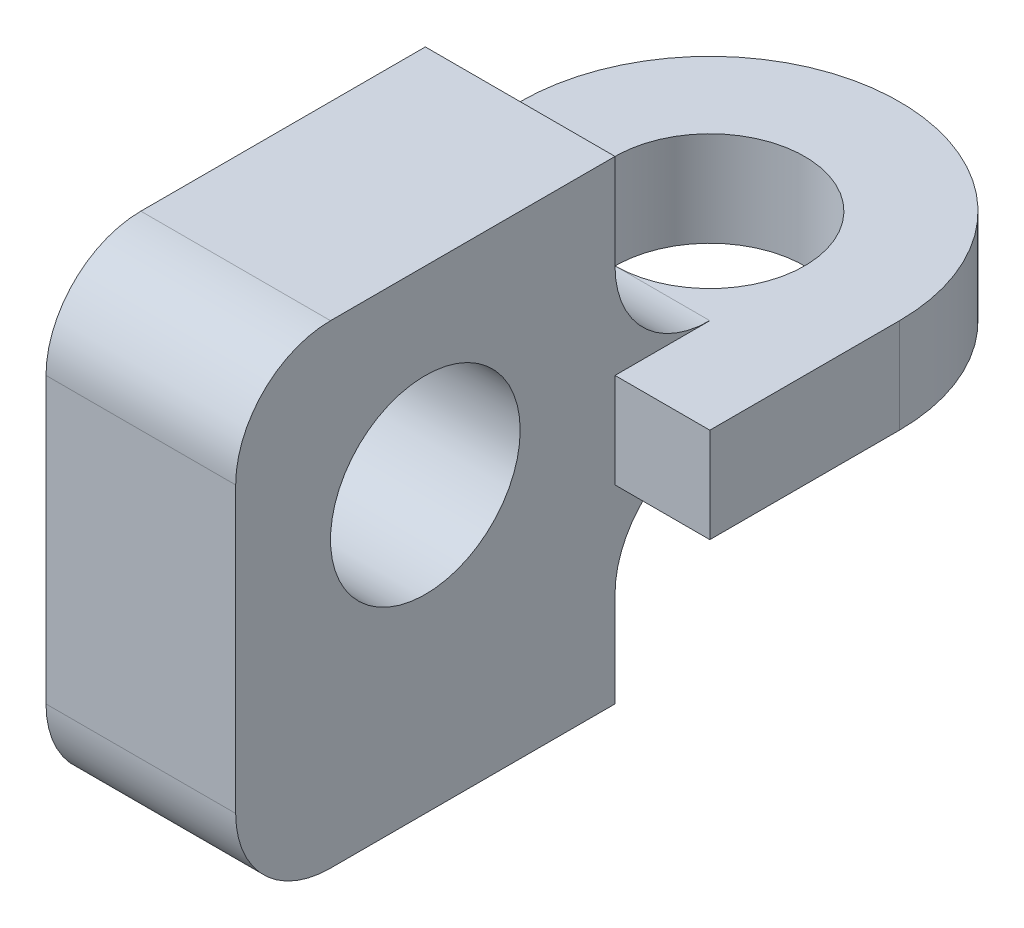
ISO-10303-21;
HEADER;
FILE_DESCRIPTION(('STEP AP214'),'2;1');
FILE_NAME('part.step','',(''),(''),'','','');
FILE_SCHEMA(('AUTOMOTIVE_DESIGN { 1 0 10303 214 1 1 1 1 }'));
ENDSEC;
DATA;
#1=APPLICATION_CONTEXT('core data for automotive mechanical design processes');
#2=APPLICATION_PROTOCOL_DEFINITION('international standard','automotive_design',2000,#1);
#3=PRODUCT_CONTEXT('',#1,'mechanical');
#4=PRODUCT('Part','Part','',(#3));
#5=PRODUCT_RELATED_PRODUCT_CATEGORY('part','',(#4));
#6=PRODUCT_DEFINITION_FORMATION('','',#4);
#7=PRODUCT_DEFINITION_CONTEXT('part definition',#1,'design');
#8=PRODUCT_DEFINITION('design','',#6,#7);
#9=PRODUCT_DEFINITION_SHAPE('','',#8);
#10=(LENGTH_UNIT() NAMED_UNIT(*) SI_UNIT(.MILLI.,.METRE.));
#11=(NAMED_UNIT(*) PLANE_ANGLE_UNIT() SI_UNIT($,.RADIAN.));
#12=(NAMED_UNIT(*) SI_UNIT($,.STERADIAN.) SOLID_ANGLE_UNIT());
#13=UNCERTAINTY_MEASURE_WITH_UNIT(LENGTH_MEASURE(1.E-05),#10,'distance_accuracy_value','');
#14=(GEOMETRIC_REPRESENTATION_CONTEXT(3) GLOBAL_UNCERTAINTY_ASSIGNED_CONTEXT((#13)) GLOBAL_UNIT_ASSIGNED_CONTEXT((#10,
#11,#12)) REPRESENTATION_CONTEXT('',''));
#15=CARTESIAN_POINT('',(0.,0.,0.));
#16=DIRECTION('',(0.,0.,1.));
#17=DIRECTION('',(1.,0.,0.));
#18=AXIS2_PLACEMENT_3D('',#15,#16,#17);
#19=CARTESIAN_POINT('',(254.,609.6,-508.));
#20=DIRECTION('',(-1.,0.,0.));
#21=DIRECTION('',(0.,0.,1.));
#22=AXIS2_PLACEMENT_3D('',#19,#20,#21);
#23=CYLINDRICAL_SURFACE('',#22,254.);
#24=CARTESIAN_POINT('',(-254.,609.6,-508.));
#25=DIRECTION('',(1.,0.,0.));
#26=DIRECTION('',(0.,0.,-1.));
#27=AXIS2_PLACEMENT_3D('',#24,#25,#26);
#28=CIRCLE('',#27,254.);
#29=CARTESIAN_POINT('',(-254.,355.6,-508.000000000002));
#30=VERTEX_POINT('',#29);
#31=CARTESIAN_POINT('',(-254.,609.600000000002,-254.));
#32=VERTEX_POINT('',#31);
#33=EDGE_CURVE('E224',#30,#32,#28,.F.);
#34=ORIENTED_EDGE('',*,*,#33,.T.);
#35=DIRECTION('',(-1.,0.,0.));
#36=VECTOR('',#35,1.);
#37=CARTESIAN_POINT('',(254.,609.600000000002,-254.));
#38=LINE('',#37,#36);
#39=CARTESIAN_POINT('',(254.,609.600000000002,-254.));
#40=VERTEX_POINT('',#39);
#41=EDGE_CURVE('E40',#40,#32,#38,.T.);
#42=ORIENTED_EDGE('',*,*,#41,.F.);
#43=CARTESIAN_POINT('',(254.,609.6,-508.));
#44=DIRECTION('',(1.,0.,0.));
#45=DIRECTION('',(0.,0.,-1.));
#46=AXIS2_PLACEMENT_3D('',#43,#44,#45);
#47=CIRCLE('',#46,254.);
#48=CARTESIAN_POINT('',(254.,355.6,-508.000000000002));
#49=VERTEX_POINT('',#48);
#50=EDGE_CURVE('E196',#49,#40,#47,.F.);
#51=ORIENTED_EDGE('',*,*,#50,.F.);
#52=DIRECTION('',(-1.,0.,0.));
#53=VECTOR('',#52,1.);
#54=CARTESIAN_POINT('',(254.,355.6,-508.000000000002));
#55=LINE('',#54,#53);
#56=CARTESIAN_POINT('',(0.,355.6,-508.000000000002));
#57=VERTEX_POINT('',#56);
#58=EDGE_CURVE('E11',#49,#57,#55,.T.);
#59=ORIENTED_EDGE('',*,*,#58,.T.);
#60=DIRECTION('',(-1.,0.,0.));
#61=VECTOR('',#60,1.);
#62=CARTESIAN_POINT('',(254.,355.6,-508.));
#63=LINE('',#62,#61);
#64=EDGE_CURVE('E180',#30,#57,#63,.F.);
#65=ORIENTED_EDGE('',*,*,#64,.F.);
#66=EDGE_LOOP('',(#34,#42,#51,#59,#65));
#67=FACE_BOUND('',#66,.T.);
#68=ADVANCED_FACE('F33',(#67),#23,.F.);
#69=CARTESIAN_POINT('',(254.,0.,-254.));
#70=DIRECTION('',(0.,0.,1.));
#71=DIRECTION('',(0.,-1.,0.));
#72=AXIS2_PLACEMENT_3D('',#69,#70,#71);
#73=PLANE('',#72);
#74=DIRECTION('',(0.,1.,0.));
#75=VECTOR('',#74,1.);
#76=CARTESIAN_POINT('',(-254.,0.,-254.));
#77=LINE('',#76,#75);
#78=CARTESIAN_POINT('',(-254.,863.6,-254.));
#79=VERTEX_POINT('',#78);
#80=EDGE_CURVE('E226',#32,#79,#77,.T.);
#81=ORIENTED_EDGE('',*,*,#80,.T.);
#82=DIRECTION('',(-1.,0.,0.));
#83=VECTOR('',#82,1.);
#84=CARTESIAN_POINT('',(254.,863.6,-254.));
#85=LINE('',#84,#83);
#86=CARTESIAN_POINT('',(254.,863.6,-254.));
#87=VERTEX_POINT('',#86);
#88=EDGE_CURVE('E263',#87,#79,#85,.T.);
#89=ORIENTED_EDGE('',*,*,#88,.F.);
#90=DIRECTION('',(0.,1.,0.));
#91=VECTOR('',#90,1.);
#92=CARTESIAN_POINT('',(254.,0.,-254.));
#93=LINE('',#92,#91);
#94=EDGE_CURVE('E198',#40,#87,#93,.T.);
#95=ORIENTED_EDGE('',*,*,#94,.F.);
#96=ORIENTED_EDGE('',*,*,#41,.T.);
#97=EDGE_LOOP('',(#81,#89,#95,#96));
#98=FACE_BOUND('',#97,.T.);
#99=ADVANCED_FACE('F270',(#98),#73,.F.);
#100=CARTESIAN_POINT('',(254.,863.6,1.25825276124185E-13));
#101=DIRECTION('',(0.,-1.,0.));
#102=DIRECTION('',(0.,0.,-1.));
#103=AXIS2_PLACEMENT_3D('',#100,#101,#102);
#104=PLANE('',#103);
#105=DIRECTION('',(0.,0.,1.));
#106=VECTOR('',#105,1.);
#107=CARTESIAN_POINT('',(-254.,863.6,1.25825276124185E-13));
#108=LINE('',#107,#106);
#109=CARTESIAN_POINT('',(-254.,863.6,507.999999999999));
#110=VERTEX_POINT('',#109);
#111=EDGE_CURVE('E228',#79,#110,#108,.T.);
#112=ORIENTED_EDGE('',*,*,#111,.T.);
#113=DIRECTION('',(-1.,0.,0.));
#114=VECTOR('',#113,1.);
#115=CARTESIAN_POINT('',(254.,863.6,507.999999999999));
#116=LINE('',#115,#114);
#117=CARTESIAN_POINT('',(254.,863.6,507.999999999999));
#118=VERTEX_POINT('',#117);
#119=EDGE_CURVE('E261',#118,#110,#116,.T.);
#120=ORIENTED_EDGE('',*,*,#119,.F.);
#121=DIRECTION('',(0.,0.,1.));
#122=VECTOR('',#121,1.);
#123=CARTESIAN_POINT('',(254.,863.6,1.25825276124185E-13));
#124=LINE('',#123,#122);
#125=EDGE_CURVE('E200',#87,#118,#124,.T.);
#126=ORIENTED_EDGE('',*,*,#125,.F.);
#127=ORIENTED_EDGE('',*,*,#88,.T.);
#128=EDGE_LOOP('',(#112,#120,#126,#127));
#129=FACE_BOUND('',#128,.T.);
#130=ADVANCED_FACE('F282',(#129),#104,.F.);
#131=CARTESIAN_POINT('',(254.,609.6,508.));
#132=DIRECTION('',(-1.,0.,0.));
#133=DIRECTION('',(0.,0.,1.));
#134=AXIS2_PLACEMENT_3D('',#131,#132,#133);
#135=CYLINDRICAL_SURFACE('',#134,254.);
#136=CARTESIAN_POINT('',(-254.,609.6,508.));
#137=DIRECTION('',(1.,0.,0.));
#138=DIRECTION('',(0.,0.,-1.));
#139=AXIS2_PLACEMENT_3D('',#136,#137,#138);
#140=CIRCLE('',#139,254.);
#141=CARTESIAN_POINT('',(-254.,609.599999999998,762.));
#142=VERTEX_POINT('',#141);
#143=EDGE_CURVE('E231',#142,#110,#140,.F.);
#144=ORIENTED_EDGE('',*,*,#143,.F.);
#145=DIRECTION('',(-1.,0.,0.));
#146=VECTOR('',#145,1.);
#147=CARTESIAN_POINT('',(254.,609.599999999998,762.));
#148=LINE('',#147,#146);
#149=CARTESIAN_POINT('',(254.,609.599999999998,762.));
#150=VERTEX_POINT('',#149);
#151=EDGE_CURVE('E259',#150,#142,#148,.T.);
#152=ORIENTED_EDGE('',*,*,#151,.F.);
#153=CARTESIAN_POINT('',(254.,609.6,508.));
#154=DIRECTION('',(1.,0.,0.));
#155=DIRECTION('',(0.,0.,-1.));
#156=AXIS2_PLACEMENT_3D('',#153,#154,#155);
#157=CIRCLE('',#156,254.);
#158=EDGE_CURVE('E202',#150,#118,#157,.F.);
#159=ORIENTED_EDGE('',*,*,#158,.T.);
#160=ORIENTED_EDGE('',*,*,#119,.T.);
#161=EDGE_LOOP('',(#144,#152,#159,#160));
#162=FACE_BOUND('',#161,.T.);
#163=ADVANCED_FACE('F344',(#162),#135,.T.);
#164=CARTESIAN_POINT('',(254.,-2.22044604925032E-13,762.));
#165=DIRECTION('',(0.,0.,-1.));
#166=DIRECTION('',(0.,1.,0.));
#167=AXIS2_PLACEMENT_3D('',#164,#165,#166);
#168=PLANE('',#167);
#169=DIRECTION('',(0.,-1.,0.));
#170=VECTOR('',#169,1.);
#171=CARTESIAN_POINT('',(-254.,-2.22044604925032E-13,762.));
#172=LINE('',#171,#170);
#173=CARTESIAN_POINT('',(-254.,-152.399999999998,762.));
#174=VERTEX_POINT('',#173);
#175=EDGE_CURVE('E234',#142,#174,#172,.T.);
#176=ORIENTED_EDGE('',*,*,#175,.T.);
#177=DIRECTION('',(-1.,0.,0.));
#178=VECTOR('',#177,1.);
#179=CARTESIAN_POINT('',(254.,-152.399999999998,762.));
#180=LINE('',#179,#178);
#181=CARTESIAN_POINT('',(254.,-152.399999999998,762.));
#182=VERTEX_POINT('',#181);
#183=EDGE_CURVE('E256',#182,#174,#180,.T.);
#184=ORIENTED_EDGE('',*,*,#183,.F.);
#185=DIRECTION('',(0.,-1.,0.));
#186=VECTOR('',#185,1.);
#187=CARTESIAN_POINT('',(254.,-2.22044604925032E-13,762.));
#188=LINE('',#187,#186);
#189=EDGE_CURVE('E205',#150,#182,#188,.T.);
#190=ORIENTED_EDGE('',*,*,#189,.F.);
#191=ORIENTED_EDGE('',*,*,#151,.T.);
#192=EDGE_LOOP('',(#176,#184,#190,#191));
#193=FACE_BOUND('',#192,.T.);
#194=ADVANCED_FACE('F342',(#193),#168,.F.);
#195=CARTESIAN_POINT('',(254.,-152.4,508.));
#196=DIRECTION('',(-1.,0.,0.));
#197=DIRECTION('',(0.,0.,1.));
#198=AXIS2_PLACEMENT_3D('',#195,#196,#197);
#199=CYLINDRICAL_SURFACE('',#198,254.);
#200=CARTESIAN_POINT('',(-254.,-152.4,508.));
#201=DIRECTION('',(1.,0.,0.));
#202=DIRECTION('',(0.,0.,-1.));
#203=AXIS2_PLACEMENT_3D('',#200,#201,#202);
#204=CIRCLE('',#203,254.);
#205=CARTESIAN_POINT('',(-254.,-406.4,507.999999999998));
#206=VERTEX_POINT('',#205);
#207=EDGE_CURVE('E236',#174,#206,#204,.T.);
#208=ORIENTED_EDGE('',*,*,#207,.T.);
#209=DIRECTION('',(-1.,0.,0.));
#210=VECTOR('',#209,1.);
#211=CARTESIAN_POINT('',(254.,-406.4,507.999999999998));
#212=LINE('',#211,#210);
#213=CARTESIAN_POINT('',(254.,-406.4,507.999999999998));
#214=VERTEX_POINT('',#213);
#215=EDGE_CURVE('E253',#214,#206,#212,.T.);
#216=ORIENTED_EDGE('',*,*,#215,.F.);
#217=CARTESIAN_POINT('',(254.,-152.4,508.));
#218=DIRECTION('',(1.,0.,0.));
#219=DIRECTION('',(0.,0.,-1.));
#220=AXIS2_PLACEMENT_3D('',#217,#218,#219);
#221=CIRCLE('',#220,254.);
#222=EDGE_CURVE('E207',#182,#214,#221,.T.);
#223=ORIENTED_EDGE('',*,*,#222,.F.);
#224=ORIENTED_EDGE('',*,*,#183,.T.);
#225=EDGE_LOOP('',(#208,#216,#223,#224));
#226=FACE_BOUND('',#225,.T.);
#227=ADVANCED_FACE('F337',(#226),#199,.T.);
#228=CARTESIAN_POINT('',(254.,-406.4,0.));
#229=DIRECTION('',(0.,1.,0.));
#230=DIRECTION('',(0.,0.,1.));
#231=AXIS2_PLACEMENT_3D('',#228,#229,#230);
#232=PLANE('',#231);
#233=DIRECTION('',(0.,0.,-1.));
#234=VECTOR('',#233,1.);
#235=CARTESIAN_POINT('',(-254.,-406.4,0.));
#236=LINE('',#235,#234);
#237=CARTESIAN_POINT('',(-254.,-406.4,-254.));
#238=VERTEX_POINT('',#237);
#239=EDGE_CURVE('E238',#206,#238,#236,.T.);
#240=ORIENTED_EDGE('',*,*,#239,.T.);
#241=DIRECTION('',(-1.,0.,0.));
#242=VECTOR('',#241,1.);
#243=CARTESIAN_POINT('',(254.,-406.4,-254.));
#244=LINE('',#243,#242);
#245=CARTESIAN_POINT('',(254.,-406.4,-254.));
#246=VERTEX_POINT('',#245);
#247=EDGE_CURVE('E250',#246,#238,#244,.T.);
#248=ORIENTED_EDGE('',*,*,#247,.F.);
#249=DIRECTION('',(0.,0.,-1.));
#250=VECTOR('',#249,1.);
#251=CARTESIAN_POINT('',(254.,-406.4,0.));
#252=LINE('',#251,#250);
#253=EDGE_CURVE('E209',#214,#246,#252,.T.);
#254=ORIENTED_EDGE('',*,*,#253,.F.);
#255=ORIENTED_EDGE('',*,*,#215,.T.);
#256=EDGE_LOOP('',(#240,#248,#254,#255));
#257=FACE_BOUND('',#256,.T.);
#258=ADVANCED_FACE('F333',(#257),#232,.F.);
#259=CARTESIAN_POINT('',(254.,0.,-254.));
#260=DIRECTION('',(0.,0.,1.));
#261=DIRECTION('',(0.,-1.,0.));
#262=AXIS2_PLACEMENT_3D('',#259,#260,#261);
#263=PLANE('',#262);
#264=DIRECTION('',(0.,1.,0.));
#265=VECTOR('',#264,1.);
#266=CARTESIAN_POINT('',(-254.,0.,-254.));
#267=LINE('',#266,#265);
#268=CARTESIAN_POINT('',(-254.,-152.400000000002,-254.));
#269=VERTEX_POINT('',#268);
#270=EDGE_CURVE('E240',#238,#269,#267,.T.);
#271=ORIENTED_EDGE('',*,*,#270,.T.);
#272=DIRECTION('',(-1.,0.,0.));
#273=VECTOR('',#272,1.);
#274=CARTESIAN_POINT('',(254.,-152.400000000002,-254.));
#275=LINE('',#274,#273);
#276=CARTESIAN_POINT('',(254.,-152.400000000002,-254.));
#277=VERTEX_POINT('',#276);
#278=EDGE_CURVE('E247',#277,#269,#275,.T.);
#279=ORIENTED_EDGE('',*,*,#278,.F.);
#280=DIRECTION('',(0.,1.,0.));
#281=VECTOR('',#280,1.);
#282=CARTESIAN_POINT('',(254.,0.,-254.));
#283=LINE('',#282,#281);
#284=EDGE_CURVE('E211',#246,#277,#283,.T.);
#285=ORIENTED_EDGE('',*,*,#284,.F.);
#286=ORIENTED_EDGE('',*,*,#247,.T.);
#287=EDGE_LOOP('',(#271,#279,#285,#286));
#288=FACE_BOUND('',#287,.T.);
#289=ADVANCED_FACE('F329',(#288),#263,.F.);
#290=CARTESIAN_POINT('',(254.,-152.4,-508.));
#291=DIRECTION('',(-1.,0.,0.));
#292=DIRECTION('',(0.,0.,1.));
#293=AXIS2_PLACEMENT_3D('',#290,#291,#292);
#294=CYLINDRICAL_SURFACE('',#293,254.);
#295=CARTESIAN_POINT('',(-254.,-152.4,-508.));
#296=DIRECTION('',(1.,0.,0.));
#297=DIRECTION('',(0.,0.,-1.));
#298=AXIS2_PLACEMENT_3D('',#295,#296,#297);
#299=CIRCLE('',#298,254.);
#300=CARTESIAN_POINT('',(-254.,101.6,-508.000000000002));
#301=VERTEX_POINT('',#300);
#302=EDGE_CURVE('E242',#269,#301,#299,.F.);
#303=ORIENTED_EDGE('',*,*,#302,.T.);
#304=DIRECTION('',(-1.,0.,0.));
#305=VECTOR('',#304,1.);
#306=CARTESIAN_POINT('',(254.,101.6,-508.));
#307=LINE('',#306,#305);
#308=CARTESIAN_POINT('',(0.,101.6,-508.000000000002));
#309=VERTEX_POINT('',#308);
#310=EDGE_CURVE('E53',#301,#309,#307,.F.);
#311=ORIENTED_EDGE('',*,*,#310,.T.);
#312=DIRECTION('',(-1.,0.,0.));
#313=VECTOR('',#312,1.);
#314=CARTESIAN_POINT('',(254.,101.6,-508.000000000002));
#315=LINE('',#314,#313);
#316=CARTESIAN_POINT('',(254.,101.6,-508.000000000002));
#317=VERTEX_POINT('',#316);
#318=EDGE_CURVE('E218',#317,#309,#315,.T.);
#319=ORIENTED_EDGE('',*,*,#318,.F.);
#320=CARTESIAN_POINT('',(254.,-152.4,-508.));
#321=DIRECTION('',(1.,0.,0.));
#322=DIRECTION('',(0.,0.,-1.));
#323=AXIS2_PLACEMENT_3D('',#320,#321,#322);
#324=CIRCLE('',#323,254.);
#325=EDGE_CURVE('E213',#277,#317,#324,.F.);
#326=ORIENTED_EDGE('',*,*,#325,.F.);
#327=ORIENTED_EDGE('',*,*,#278,.T.);
#328=EDGE_LOOP('',(#303,#311,#319,#326,#327));
#329=FACE_BOUND('',#328,.T.);
#330=ADVANCED_FACE('F324',(#329),#294,.F.);
#331=CARTESIAN_POINT('',(254.,355.6,254.));
#332=DIRECTION('',(-1.,0.,0.));
#333=DIRECTION('',(0.,0.,1.));
#334=AXIS2_PLACEMENT_3D('',#331,#332,#333);
#335=CYLINDRICAL_SURFACE('',#334,254.);
#336=CARTESIAN_POINT('',(254.,355.6,254.));
#337=DIRECTION('',(1.,0.,0.));
#338=DIRECTION('',(0.,0.,-1.));
#339=AXIS2_PLACEMENT_3D('',#336,#337,#338);
#340=CIRCLE('',#339,254.);
#341=CARTESIAN_POINT('',(254.,355.6,0.));
#342=VERTEX_POINT('',#341);
#343=EDGE_CURVE('E215',#342,#342,#340,.T.);
#344=ORIENTED_EDGE('',*,*,#343,.T.);
#345=EDGE_LOOP('',(#344));
#346=FACE_BOUND('',#345,.T.);
#347=CARTESIAN_POINT('',(-254.,355.6,254.));
#348=DIRECTION('',(1.,0.,0.));
#349=DIRECTION('',(0.,0.,-1.));
#350=AXIS2_PLACEMENT_3D('',#347,#348,#349);
#351=CIRCLE('',#350,254.);
#352=CARTESIAN_POINT('',(-254.,355.6,0.));
#353=VERTEX_POINT('',#352);
#354=EDGE_CURVE('E192',#353,#353,#351,.T.);
#355=ORIENTED_EDGE('',*,*,#354,.F.);
#356=EDGE_LOOP('',(#355));
#357=FACE_BOUND('',#356,.T.);
#358=ADVANCED_FACE('F404',(#346,#357),#335,.F.);
#359=CARTESIAN_POINT('',(254.,0.,0.));
#360=DIRECTION('',(1.,0.,0.));
#361=DIRECTION('',(0.,0.,-1.));
#362=AXIS2_PLACEMENT_3D('',#359,#360,#361);
#363=PLANE('',#362);
#364=DIRECTION('',(0.,0.,1.));
#365=VECTOR('',#364,1.);
#366=CARTESIAN_POINT('',(254.,101.6,0.));
#367=LINE('',#366,#365);
#368=CARTESIAN_POINT('',(254.,101.6,-254.));
#369=VERTEX_POINT('',#368);
#370=EDGE_CURVE('E189',#317,#369,#367,.T.);
#371=ORIENTED_EDGE('',*,*,#370,.T.);
#372=DIRECTION('',(0.,1.,0.));
#373=VECTOR('',#372,1.);
#374=CARTESIAN_POINT('',(254.,0.,-254.));
#375=LINE('',#374,#373);
#376=CARTESIAN_POINT('',(254.,355.6,-254.));
#377=VERTEX_POINT('',#376);
#378=EDGE_CURVE('E191',#369,#377,#375,.T.);
#379=ORIENTED_EDGE('',*,*,#378,.T.);
#380=DIRECTION('',(0.,0.,-1.));
#381=VECTOR('',#380,1.);
#382=CARTESIAN_POINT('',(254.,355.6,0.));
#383=LINE('',#382,#381);
#384=EDGE_CURVE('E194',#377,#49,#383,.T.);
#385=ORIENTED_EDGE('',*,*,#384,.T.);
#386=ORIENTED_EDGE('',*,*,#50,.T.);
#387=ORIENTED_EDGE('',*,*,#94,.T.);
#388=ORIENTED_EDGE('',*,*,#125,.T.);
#389=ORIENTED_EDGE('',*,*,#158,.F.);
#390=ORIENTED_EDGE('',*,*,#189,.T.);
#391=ORIENTED_EDGE('',*,*,#222,.T.);
#392=ORIENTED_EDGE('',*,*,#253,.T.);
#393=ORIENTED_EDGE('',*,*,#284,.T.);
#394=ORIENTED_EDGE('',*,*,#325,.T.);
#395=EDGE_LOOP('',(#371,#379,#385,#386,#387,#388,#389,#390,#391,#392,#393,#394));
#396=FACE_BOUND('',#395,.T.);
#397=ORIENTED_EDGE('',*,*,#343,.F.);
#398=EDGE_LOOP('',(#397));
#399=FACE_BOUND('',#398,.T.);
#400=ADVANCED_FACE('F286',(#396,#399),#363,.T.);
#401=CARTESIAN_POINT('',(-254.,0.,0.));
#402=DIRECTION('',(1.,0.,0.));
#403=DIRECTION('',(0.,0.,-1.));
#404=AXIS2_PLACEMENT_3D('',#401,#402,#403);
#405=PLANE('',#404);
#406=DIRECTION('',(0.,0.,1.));
#407=VECTOR('',#406,1.);
#408=CARTESIAN_POINT('',(-254.,101.6,0.));
#409=LINE('',#408,#407);
#410=CARTESIAN_POINT('',(-254.,101.6,-254.));
#411=VERTEX_POINT('',#410);
#412=EDGE_CURVE('E188',#301,#411,#409,.T.);
#413=ORIENTED_EDGE('',*,*,#412,.F.);
#414=ORIENTED_EDGE('',*,*,#302,.F.);
#415=ORIENTED_EDGE('',*,*,#270,.F.);
#416=ORIENTED_EDGE('',*,*,#239,.F.);
#417=ORIENTED_EDGE('',*,*,#207,.F.);
#418=ORIENTED_EDGE('',*,*,#175,.F.);
#419=ORIENTED_EDGE('',*,*,#143,.T.);
#420=ORIENTED_EDGE('',*,*,#111,.F.);
#421=ORIENTED_EDGE('',*,*,#80,.F.);
#422=ORIENTED_EDGE('',*,*,#33,.F.);
#423=DIRECTION('',(0.,0.,-1.));
#424=VECTOR('',#423,1.);
#425=CARTESIAN_POINT('',(-254.,355.6,0.));
#426=LINE('',#425,#424);
#427=CARTESIAN_POINT('',(-254.,355.6,-254.));
#428=VERTEX_POINT('',#427);
#429=EDGE_CURVE('E222',#428,#30,#426,.T.);
#430=ORIENTED_EDGE('',*,*,#429,.F.);
#431=DIRECTION('',(0.,1.,0.));
#432=VECTOR('',#431,1.);
#433=CARTESIAN_POINT('',(-254.,0.,-254.));
#434=LINE('',#433,#432);
#435=EDGE_CURVE('E159',#411,#428,#434,.T.);
#436=ORIENTED_EDGE('',*,*,#435,.F.);
#437=EDGE_LOOP('',(#413,#414,#415,#416,#417,#418,#419,#420,#421,#422,#430,#436));
#438=FACE_BOUND('',#437,.T.);
#439=ORIENTED_EDGE('',*,*,#354,.T.);
#440=EDGE_LOOP('',(#439));
#441=FACE_BOUND('',#440,.T.);
#442=ADVANCED_FACE('F276',(#438,#441),#405,.F.);
#443=CARTESIAN_POINT('',(-508.,355.6,-254.));
#444=DIRECTION('',(0.,0.,-1.));
#445=DIRECTION('',(-1.,0.,0.));
#446=AXIS2_PLACEMENT_3D('',#443,#444,#445);
#447=PLANE('',#446);
#448=DIRECTION('',(1.,0.,0.));
#449=VECTOR('',#448,1.);
#450=CARTESIAN_POINT('',(-508.,101.6,-254.));
#451=LINE('',#450,#449);
#452=CARTESIAN_POINT('',(-508.,101.6,-254.));
#453=VERTEX_POINT('',#452);
#454=EDGE_CURVE('E304',#453,#411,#451,.T.);
#455=ORIENTED_EDGE('',*,*,#454,.T.);
#456=ORIENTED_EDGE('',*,*,#435,.T.);
#457=DIRECTION('',(1.,0.,0.));
#458=VECTOR('',#457,1.);
#459=CARTESIAN_POINT('',(-508.,355.6,-254.));
#460=LINE('',#459,#458);
#461=CARTESIAN_POINT('',(-508.,355.6,-254.));
#462=VERTEX_POINT('',#461);
#463=EDGE_CURVE('E152',#462,#428,#460,.T.);
#464=ORIENTED_EDGE('',*,*,#463,.F.);
#465=DIRECTION('',(0.,-1.,0.));
#466=VECTOR('',#465,1.);
#467=CARTESIAN_POINT('',(-508.,355.6,-254.));
#468=LINE('',#467,#466);
#469=EDGE_CURVE('E157',#462,#453,#468,.T.);
#470=ORIENTED_EDGE('',*,*,#469,.T.);
#471=EDGE_LOOP('',(#455,#456,#464,#470));
#472=FACE_BOUND('',#471,.T.);
#473=ADVANCED_FACE('F155',(#472),#447,.F.);
#474=CARTESIAN_POINT('',(0.,355.6,-762.));
#475=DIRECTION('',(0.,1.,0.));
#476=DIRECTION('',(0.,0.,1.));
#477=AXIS2_PLACEMENT_3D('',#474,#475,#476);
#478=PLANE('',#477);
#479=ORIENTED_EDGE('',*,*,#58,.F.);
#480=ORIENTED_EDGE('',*,*,#384,.F.);
#481=CARTESIAN_POINT('',(508.,355.6,-254.));
#482=VERTEX_POINT('',#481);
#483=EDGE_CURVE('E163',#377,#482,#460,.T.);
#484=ORIENTED_EDGE('',*,*,#483,.T.);
#485=DIRECTION('',(0.,0.,-1.));
#486=VECTOR('',#485,1.);
#487=CARTESIAN_POINT('',(508.,355.6,-254.));
#488=LINE('',#487,#486);
#489=CARTESIAN_POINT('',(508.,355.6,-762.));
#490=VERTEX_POINT('',#489);
#491=EDGE_CURVE('E162',#482,#490,#488,.T.);
#492=ORIENTED_EDGE('',*,*,#491,.T.);
#493=CARTESIAN_POINT('',(0.,355.6,-762.));
#494=DIRECTION('',(0.,1.,0.));
#495=DIRECTION('',(0.,0.,1.));
#496=AXIS2_PLACEMENT_3D('',#493,#494,#495);
#497=CIRCLE('',#496,508.);
#498=CARTESIAN_POINT('',(-508.,355.6,-762.));
#499=VERTEX_POINT('',#498);
#500=EDGE_CURVE('E169',#490,#499,#497,.T.);
#501=ORIENTED_EDGE('',*,*,#500,.T.);
#502=DIRECTION('',(0.,0.,1.));
#503=VECTOR('',#502,1.);
#504=CARTESIAN_POINT('',(-508.,355.6,-254.));
#505=LINE('',#504,#503);
#506=EDGE_CURVE('E166',#499,#462,#505,.T.);
#507=ORIENTED_EDGE('',*,*,#506,.T.);
#508=ORIENTED_EDGE('',*,*,#463,.T.);
#509=ORIENTED_EDGE('',*,*,#429,.T.);
#510=ORIENTED_EDGE('',*,*,#64,.T.);
#511=CARTESIAN_POINT('',(0.,355.6,-762.));
#512=DIRECTION('',(0.,1.,0.));
#513=DIRECTION('',(0.,0.,1.));
#514=AXIS2_PLACEMENT_3D('',#511,#512,#513);
#515=CIRCLE('',#514,254.);
#516=EDGE_CURVE('E292',#57,#57,#515,.T.);
#517=ORIENTED_EDGE('',*,*,#516,.F.);
#518=EDGE_LOOP('',(#479,#480,#484,#492,#501,#507,#508,#509,#510,#517));
#519=FACE_BOUND('',#518,.T.);
#520=ADVANCED_FACE('F167',(#519),#478,.T.);
#521=CARTESIAN_POINT('',(0.,101.6,-762.));
#522=DIRECTION('',(0.,1.,0.));
#523=DIRECTION('',(0.,0.,1.));
#524=AXIS2_PLACEMENT_3D('',#521,#522,#523);
#525=PLANE('',#524);
#526=ORIENTED_EDGE('',*,*,#370,.F.);
#527=ORIENTED_EDGE('',*,*,#318,.T.);
#528=CARTESIAN_POINT('',(0.,101.6,-762.));
#529=DIRECTION('',(0.,1.,0.));
#530=DIRECTION('',(0.,0.,1.));
#531=AXIS2_PLACEMENT_3D('',#528,#529,#530);
#532=CIRCLE('',#531,254.);
#533=EDGE_CURVE('E294',#309,#309,#532,.T.);
#534=ORIENTED_EDGE('',*,*,#533,.T.);
#535=ORIENTED_EDGE('',*,*,#310,.F.);
#536=ORIENTED_EDGE('',*,*,#412,.T.);
#537=ORIENTED_EDGE('',*,*,#454,.F.);
#538=DIRECTION('',(0.,0.,1.));
#539=VECTOR('',#538,1.);
#540=CARTESIAN_POINT('',(-508.,101.6,-254.));
#541=LINE('',#540,#539);
#542=CARTESIAN_POINT('',(-508.,101.6,-762.));
#543=VERTEX_POINT('',#542);
#544=EDGE_CURVE('E177',#543,#453,#541,.T.);
#545=ORIENTED_EDGE('',*,*,#544,.F.);
#546=CARTESIAN_POINT('',(0.,101.6,-762.));
#547=DIRECTION('',(0.,1.,0.));
#548=DIRECTION('',(0.,0.,1.));
#549=AXIS2_PLACEMENT_3D('',#546,#547,#548);
#550=CIRCLE('',#549,508.);
#551=CARTESIAN_POINT('',(508.,101.6,-762.));
#552=VERTEX_POINT('',#551);
#553=EDGE_CURVE('E173',#552,#543,#550,.T.);
#554=ORIENTED_EDGE('',*,*,#553,.F.);
#555=DIRECTION('',(0.,0.,-1.));
#556=VECTOR('',#555,1.);
#557=CARTESIAN_POINT('',(508.,101.6,-254.));
#558=LINE('',#557,#556);
#559=CARTESIAN_POINT('',(508.,101.6,-254.));
#560=VERTEX_POINT('',#559);
#561=EDGE_CURVE('E306',#560,#552,#558,.T.);
#562=ORIENTED_EDGE('',*,*,#561,.F.);
#563=EDGE_CURVE('E296',#369,#560,#451,.T.);
#564=ORIENTED_EDGE('',*,*,#563,.F.);
#565=EDGE_LOOP('',(#526,#527,#534,#535,#536,#537,#545,#554,#562,#564));
#566=FACE_BOUND('',#565,.T.);
#567=ADVANCED_FACE('F319',(#566),#525,.F.);
#568=CARTESIAN_POINT('',(-508.,355.6,-254.));
#569=DIRECTION('',(1.,0.,0.));
#570=DIRECTION('',(0.,0.,-1.));
#571=AXIS2_PLACEMENT_3D('',#568,#569,#570);
#572=PLANE('',#571);
#573=ORIENTED_EDGE('',*,*,#544,.T.);
#574=ORIENTED_EDGE('',*,*,#469,.F.);
#575=ORIENTED_EDGE('',*,*,#506,.F.);
#576=DIRECTION('',(0.,-1.,0.));
#577=VECTOR('',#576,1.);
#578=CARTESIAN_POINT('',(-508.,355.6,-762.));
#579=LINE('',#578,#577);
#580=EDGE_CURVE('E302',#499,#543,#579,.T.);
#581=ORIENTED_EDGE('',*,*,#580,.T.);
#582=EDGE_LOOP('',(#573,#574,#575,#581));
#583=FACE_BOUND('',#582,.T.);
#584=ADVANCED_FACE('F175',(#583),#572,.F.);
#585=ORIENTED_EDGE('',*,*,#378,.F.);
#586=ORIENTED_EDGE('',*,*,#563,.T.);
#587=DIRECTION('',(0.,-1.,0.));
#588=VECTOR('',#587,1.);
#589=CARTESIAN_POINT('',(508.,355.6,-254.));
#590=LINE('',#589,#588);
#591=EDGE_CURVE('E178',#482,#560,#590,.T.);
#592=ORIENTED_EDGE('',*,*,#591,.F.);
#593=ORIENTED_EDGE('',*,*,#483,.F.);
#594=EDGE_LOOP('',(#585,#586,#592,#593));
#595=FACE_BOUND('',#594,.T.);
#596=ADVANCED_FACE('F445',(#595),#447,.F.);
#597=CARTESIAN_POINT('',(508.,355.6,-254.));
#598=DIRECTION('',(-1.,0.,0.));
#599=DIRECTION('',(0.,0.,1.));
#600=AXIS2_PLACEMENT_3D('',#597,#598,#599);
#601=PLANE('',#600);
#602=ORIENTED_EDGE('',*,*,#561,.T.);
#603=DIRECTION('',(0.,-1.,0.));
#604=VECTOR('',#603,1.);
#605=CARTESIAN_POINT('',(508.,355.6,-762.));
#606=LINE('',#605,#604);
#607=EDGE_CURVE('E183',#490,#552,#606,.T.);
#608=ORIENTED_EDGE('',*,*,#607,.F.);
#609=ORIENTED_EDGE('',*,*,#491,.F.);
#610=ORIENTED_EDGE('',*,*,#591,.T.);
#611=EDGE_LOOP('',(#602,#608,#609,#610));
#612=FACE_BOUND('',#611,.T.);
#613=ADVANCED_FACE('F477',(#612),#601,.F.);
#614=CARTESIAN_POINT('',(0.,355.6,-762.));
#615=DIRECTION('',(0.,-1.,0.));
#616=DIRECTION('',(0.,0.,-1.));
#617=AXIS2_PLACEMENT_3D('',#614,#615,#616);
#618=CYLINDRICAL_SURFACE('',#617,508.);
#619=ORIENTED_EDGE('',*,*,#553,.T.);
#620=ORIENTED_EDGE('',*,*,#580,.F.);
#621=ORIENTED_EDGE('',*,*,#500,.F.);
#622=ORIENTED_EDGE('',*,*,#607,.T.);
#623=EDGE_LOOP('',(#619,#620,#621,#622));
#624=FACE_BOUND('',#623,.T.);
#625=ADVANCED_FACE('F313',(#624),#618,.T.);
#626=CARTESIAN_POINT('',(0.,355.6,-762.));
#627=DIRECTION('',(0.,-1.,0.));
#628=DIRECTION('',(0.,0.,-1.));
#629=AXIS2_PLACEMENT_3D('',#626,#627,#628);
#630=CYLINDRICAL_SURFACE('',#629,254.);
#631=ORIENTED_EDGE('',*,*,#516,.T.);
#632=EDGE_LOOP('',(#631));
#633=FACE_BOUND('',#632,.T.);
#634=ORIENTED_EDGE('',*,*,#533,.F.);
#635=EDGE_LOOP('',(#634));
#636=FACE_BOUND('',#635,.T.);
#637=ADVANCED_FACE('F494',(#633,#636),#630,.F.);
#638=CLOSED_SHELL('',(#68,#99,#130,#163,#194,#227,#258,#289,#330,#358,#400,#442,#473,#520,#567,
#584,#596,#613,#625,#637));
#639=MANIFOLD_SOLID_BREP('B2',#638);
#640=ADVANCED_BREP_SHAPE_REPRESENTATION('',(#18,#639),#14);
#641=SHAPE_DEFINITION_REPRESENTATION(#9,#640);
ENDSEC;
END-ISO-10303-21;
